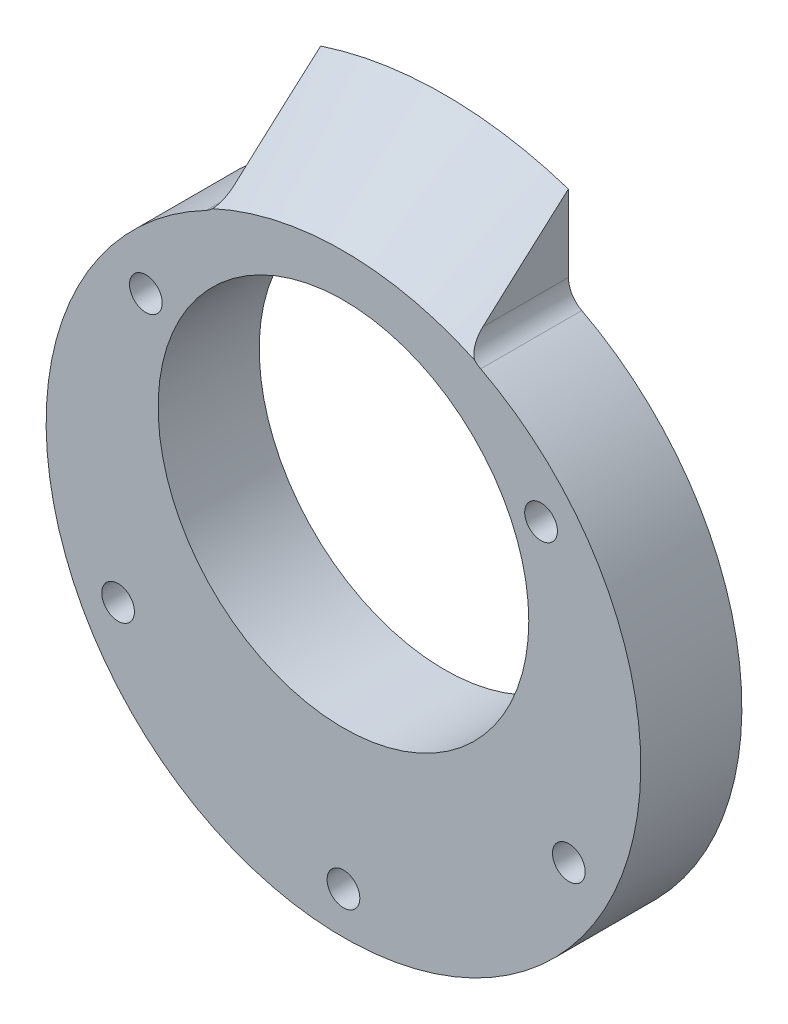
ISO-10303-21;
HEADER;
FILE_DESCRIPTION(('STEP AP214'),'2;1');
FILE_NAME('part.step','',(''),(''),'','','');
FILE_SCHEMA(('AUTOMOTIVE_DESIGN { 1 0 10303 214 1 1 1 1 }'));
ENDSEC;
DATA;
#1=APPLICATION_CONTEXT('core data for automotive mechanical design processes');
#2=APPLICATION_PROTOCOL_DEFINITION('international standard','automotive_design',2000,#1);
#3=PRODUCT_CONTEXT('',#1,'mechanical');
#4=PRODUCT('Part','Part','',(#3));
#5=PRODUCT_RELATED_PRODUCT_CATEGORY('part','',(#4));
#6=PRODUCT_DEFINITION_FORMATION('','',#4);
#7=PRODUCT_DEFINITION_CONTEXT('part definition',#1,'design');
#8=PRODUCT_DEFINITION('design','',#6,#7);
#9=PRODUCT_DEFINITION_SHAPE('','',#8);
#10=(LENGTH_UNIT() NAMED_UNIT(*) SI_UNIT(.MILLI.,.METRE.));
#11=(NAMED_UNIT(*) PLANE_ANGLE_UNIT() SI_UNIT($,.RADIAN.));
#12=(NAMED_UNIT(*) SI_UNIT($,.STERADIAN.) SOLID_ANGLE_UNIT());
#13=UNCERTAINTY_MEASURE_WITH_UNIT(LENGTH_MEASURE(1.E-05),#10,'distance_accuracy_value','');
#14=(GEOMETRIC_REPRESENTATION_CONTEXT(3) GLOBAL_UNCERTAINTY_ASSIGNED_CONTEXT((#13)) GLOBAL_UNIT_ASSIGNED_CONTEXT((#10,
#11,#12)) REPRESENTATION_CONTEXT('',''));
#15=CARTESIAN_POINT('',(0.,0.,0.));
#16=DIRECTION('',(0.,0.,1.));
#17=DIRECTION('',(1.,0.,0.));
#18=AXIS2_PLACEMENT_3D('',#15,#16,#17);
#19=CARTESIAN_POINT('',(22.7400198301594,-12.081142252451,17.201));
#20=DIRECTION('',(0.,0.,-1.));
#21=DIRECTION('',(-1.,0.,0.));
#22=AXIS2_PLACEMENT_3D('',#19,#20,#21);
#23=CYLINDRICAL_SURFACE('',#22,1.65);
#24=CARTESIAN_POINT('',(22.7400198301594,-12.081142252451,17.2));
#25=DIRECTION('',(0.,0.,1.));
#26=DIRECTION('',(1.,0.,0.));
#27=AXIS2_PLACEMENT_3D('',#24,#25,#26);
#28=CIRCLE('',#27,1.65);
#29=CARTESIAN_POINT('',(24.3900198301594,-12.081142252451,17.2));
#30=VERTEX_POINT('',#29);
#31=EDGE_CURVE('E281',#30,#30,#28,.T.);
#32=ORIENTED_EDGE('',*,*,#31,.T.);
#33=EDGE_LOOP('',(#32));
#34=FACE_BOUND('',#33,.T.);
#35=CARTESIAN_POINT('',(22.7400198301594,-12.081142252451,14.2));
#36=DIRECTION('',(0.,0.,1.));
#37=DIRECTION('',(1.,0.,0.));
#38=AXIS2_PLACEMENT_3D('',#35,#36,#37);
#39=CIRCLE('',#38,1.65);
#40=CARTESIAN_POINT('',(24.3900198301594,-12.081142252451,14.2));
#41=VERTEX_POINT('',#40);
#42=EDGE_CURVE('E285',#41,#41,#39,.T.);
#43=ORIENTED_EDGE('',*,*,#42,.F.);
#44=EDGE_LOOP('',(#43));
#45=FACE_BOUND('',#44,.T.);
#46=ADVANCED_FACE('F50',(#34,#45),#23,.F.);
#47=CARTESIAN_POINT('',(19.9368843370751,16.2967218461287,17.201));
#48=DIRECTION('',(0.,0.,-1.));
#49=DIRECTION('',(-1.,0.,0.));
#50=AXIS2_PLACEMENT_3D('',#47,#48,#49);
#51=CYLINDRICAL_SURFACE('',#50,1.65);
#52=CARTESIAN_POINT('',(19.9368843370751,16.2967218461287,17.2));
#53=DIRECTION('',(0.,0.,1.));
#54=DIRECTION('',(1.,0.,0.));
#55=AXIS2_PLACEMENT_3D('',#52,#53,#54);
#56=CIRCLE('',#55,1.65);
#57=CARTESIAN_POINT('',(21.5868843370751,16.2967218461287,17.2));
#58=VERTEX_POINT('',#57);
#59=EDGE_CURVE('E289',#58,#58,#56,.T.);
#60=ORIENTED_EDGE('',*,*,#59,.T.);
#61=EDGE_LOOP('',(#60));
#62=FACE_BOUND('',#61,.T.);
#63=CARTESIAN_POINT('',(19.9368843370751,16.2967218461287,14.2));
#64=DIRECTION('',(0.,0.,1.));
#65=DIRECTION('',(1.,0.,0.));
#66=AXIS2_PLACEMENT_3D('',#63,#64,#65);
#67=CIRCLE('',#66,1.65);
#68=CARTESIAN_POINT('',(21.5868843370751,16.2967218461287,14.2));
#69=VERTEX_POINT('',#68);
#70=EDGE_CURVE('E309',#69,#69,#67,.T.);
#71=ORIENTED_EDGE('',*,*,#70,.F.);
#72=EDGE_LOOP('',(#71));
#73=FACE_BOUND('',#72,.T.);
#74=ADVANCED_FACE('F377',(#62,#73),#51,.F.);
#75=CARTESIAN_POINT('',(-19.9368843370751,16.2967218461287,17.201));
#76=DIRECTION('',(0.,0.,-1.));
#77=DIRECTION('',(-1.,0.,0.));
#78=AXIS2_PLACEMENT_3D('',#75,#76,#77);
#79=CYLINDRICAL_SURFACE('',#78,1.65);
#80=CARTESIAN_POINT('',(-19.9368843370751,16.2967218461287,17.2));
#81=DIRECTION('',(0.,0.,1.));
#82=DIRECTION('',(1.,0.,0.));
#83=AXIS2_PLACEMENT_3D('',#80,#81,#82);
#84=CIRCLE('',#83,1.65);
#85=CARTESIAN_POINT('',(-18.2868843370751,16.2967218461287,17.2));
#86=VERTEX_POINT('',#85);
#87=EDGE_CURVE('E306',#86,#86,#84,.T.);
#88=ORIENTED_EDGE('',*,*,#87,.T.);
#89=EDGE_LOOP('',(#88));
#90=FACE_BOUND('',#89,.T.);
#91=CARTESIAN_POINT('',(-19.9368843370751,16.2967218461287,14.2));
#92=DIRECTION('',(0.,0.,1.));
#93=DIRECTION('',(1.,0.,0.));
#94=AXIS2_PLACEMENT_3D('',#91,#92,#93);
#95=CIRCLE('',#94,1.65);
#96=CARTESIAN_POINT('',(-18.2868843370751,16.2967218461287,14.2));
#97=VERTEX_POINT('',#96);
#98=EDGE_CURVE('E303',#97,#97,#95,.T.);
#99=ORIENTED_EDGE('',*,*,#98,.F.);
#100=EDGE_LOOP('',(#99));
#101=FACE_BOUND('',#100,.T.);
#102=ADVANCED_FACE('F382',(#90,#101),#79,.F.);
#103=CARTESIAN_POINT('',(-22.7400198301594,-12.081142252451,17.201));
#104=DIRECTION('',(0.,0.,-1.));
#105=DIRECTION('',(-1.,0.,0.));
#106=AXIS2_PLACEMENT_3D('',#103,#104,#105);
#107=CYLINDRICAL_SURFACE('',#106,1.65);
#108=CARTESIAN_POINT('',(-22.7400198301594,-12.081142252451,17.2));
#109=DIRECTION('',(0.,0.,1.));
#110=DIRECTION('',(1.,0.,0.));
#111=AXIS2_PLACEMENT_3D('',#108,#109,#110);
#112=CIRCLE('',#111,1.65);
#113=CARTESIAN_POINT('',(-21.0900198301594,-12.081142252451,17.2));
#114=VERTEX_POINT('',#113);
#115=EDGE_CURVE('E300',#114,#114,#112,.T.);
#116=ORIENTED_EDGE('',*,*,#115,.T.);
#117=EDGE_LOOP('',(#116));
#118=FACE_BOUND('',#117,.T.);
#119=CARTESIAN_POINT('',(-22.7400198301594,-12.081142252451,14.2));
#120=DIRECTION('',(0.,0.,1.));
#121=DIRECTION('',(1.,0.,0.));
#122=AXIS2_PLACEMENT_3D('',#119,#120,#121);
#123=CIRCLE('',#122,1.65);
#124=CARTESIAN_POINT('',(-21.0900198301594,-12.081142252451,14.2));
#125=VERTEX_POINT('',#124);
#126=EDGE_CURVE('E295',#125,#125,#123,.T.);
#127=ORIENTED_EDGE('',*,*,#126,.F.);
#128=EDGE_LOOP('',(#127));
#129=FACE_BOUND('',#128,.T.);
#130=ADVANCED_FACE('F415',(#118,#129),#107,.F.);
#131=CARTESIAN_POINT('',(0.,-25.75,17.201));
#132=DIRECTION('',(0.,0.,-1.));
#133=DIRECTION('',(-1.,0.,0.));
#134=AXIS2_PLACEMENT_3D('',#131,#132,#133);
#135=CYLINDRICAL_SURFACE('',#134,1.65);
#136=CARTESIAN_POINT('',(0.,-25.75,17.2));
#137=DIRECTION('',(0.,0.,1.));
#138=DIRECTION('',(1.,0.,0.));
#139=AXIS2_PLACEMENT_3D('',#136,#137,#138);
#140=CIRCLE('',#139,1.65);
#141=CARTESIAN_POINT('',(1.65,-25.75,17.2));
#142=VERTEX_POINT('',#141);
#143=EDGE_CURVE('E292',#142,#142,#140,.T.);
#144=ORIENTED_EDGE('',*,*,#143,.T.);
#145=EDGE_LOOP('',(#144));
#146=FACE_BOUND('',#145,.T.);
#147=CARTESIAN_POINT('',(0.,-25.75,14.2));
#148=DIRECTION('',(0.,0.,1.));
#149=DIRECTION('',(1.,0.,0.));
#150=AXIS2_PLACEMENT_3D('',#147,#148,#149);
#151=CIRCLE('',#150,1.65);
#152=CARTESIAN_POINT('',(1.65,-25.75,14.2));
#153=VERTEX_POINT('',#152);
#154=EDGE_CURVE('E296',#153,#153,#151,.T.);
#155=ORIENTED_EDGE('',*,*,#154,.F.);
#156=EDGE_LOOP('',(#155));
#157=FACE_BOUND('',#156,.T.);
#158=ADVANCED_FACE('F388',(#146,#157),#135,.F.);
#159=CARTESIAN_POINT('',(0.,0.,17.2));
#160=DIRECTION('',(0.,0.,1.));
#161=DIRECTION('',(1.,0.,0.));
#162=AXIS2_PLACEMENT_3D('',#159,#160,#161);
#163=PLANE('',#162);
#164=ORIENTED_EDGE('',*,*,#143,.F.);
#165=EDGE_LOOP('',(#164));
#166=FACE_BOUND('',#165,.T.);
#167=ORIENTED_EDGE('',*,*,#115,.F.);
#168=EDGE_LOOP('',(#167));
#169=FACE_BOUND('',#168,.T.);
#170=ORIENTED_EDGE('',*,*,#87,.F.);
#171=EDGE_LOOP('',(#170));
#172=FACE_BOUND('',#171,.T.);
#173=ORIENTED_EDGE('',*,*,#59,.F.);
#174=EDGE_LOOP('',(#173));
#175=FACE_BOUND('',#174,.T.);
#176=ORIENTED_EDGE('',*,*,#31,.F.);
#177=EDGE_LOOP('',(#176));
#178=FACE_BOUND('',#177,.T.);
#179=CARTESIAN_POINT('',(0.,7.,17.2));
#180=DIRECTION('',(0.,0.,1.));
#181=DIRECTION('',(1.,0.,0.));
#182=AXIS2_PLACEMENT_3D('',#179,#180,#181);
#183=CIRCLE('',#182,18.7);
#184=CARTESIAN_POINT('',(18.7,7.,17.2));
#185=VERTEX_POINT('',#184);
#186=EDGE_CURVE('E128',#185,#185,#183,.T.);
#187=ORIENTED_EDGE('',*,*,#186,.F.);
#188=EDGE_LOOP('',(#187));
#189=FACE_BOUND('',#188,.T.);
#190=CARTESIAN_POINT('',(0.,-1.36410985670536,17.2));
#191=DIRECTION('',(0.,0.,-1.));
#192=DIRECTION('',(0.,1.,0.));
#193=AXIS2_PLACEMENT_3D('',#190,#191,#192);
#194=CIRCLE('',#193,31.3641098567054);
#195=CARTESIAN_POINT('',(-13.2167610524739,27.0792481445098,17.2));
#196=VERTEX_POINT('',#195);
#197=CARTESIAN_POINT('',(13.2167610524739,27.0792481445098,17.2));
#198=VERTEX_POINT('',#197);
#199=EDGE_CURVE('E114',#196,#198,#194,.T.);
#200=ORIENTED_EDGE('',*,*,#199,.F.);
#201=CARTESIAN_POINT('',(-15.,28.831406486677,17.2));
#202=DIRECTION('',(0.,0.,1.));
#203=DIRECTION('',(1.,0.,0.));
#204=AXIS2_PLACEMENT_3D('',#201,#202,#203);
#205=CIRCLE('',#204,2.5);
#206=CARTESIAN_POINT('',(-13.8461538461538,26.6136059877019,17.2));
#207=VERTEX_POINT('',#206);
#208=EDGE_CURVE('E108',#196,#207,#205,.F.);
#209=ORIENTED_EDGE('',*,*,#208,.T.);
#210=CARTESIAN_POINT('',(0.,0.,17.2));
#211=DIRECTION('',(0.,0.,1.));
#212=DIRECTION('',(1.,0.,0.));
#213=AXIS2_PLACEMENT_3D('',#210,#211,#212);
#214=CIRCLE('',#213,30.);
#215=CARTESIAN_POINT('',(13.8461538461539,26.6136059877018,17.2));
#216=VERTEX_POINT('',#215);
#217=EDGE_CURVE('E112',#207,#216,#214,.T.);
#218=ORIENTED_EDGE('',*,*,#217,.T.);
#219=CARTESIAN_POINT('',(15.,28.831406486677,17.2));
#220=DIRECTION('',(0.,0.,1.));
#221=DIRECTION('',(1.,0.,0.));
#222=AXIS2_PLACEMENT_3D('',#219,#220,#221);
#223=CIRCLE('',#222,2.5);
#224=EDGE_CURVE('E119',#216,#198,#223,.F.);
#225=ORIENTED_EDGE('',*,*,#224,.T.);
#226=EDGE_LOOP('',(#200,#209,#218,#225));
#227=FACE_BOUND('',#226,.T.);
#228=ADVANCED_FACE('F110',(#166,#169,#172,#175,#178,#189,#227),#163,.T.);
#229=CARTESIAN_POINT('',(0.,-1.36410985670536,17.2));
#230=DIRECTION('',(0.,0.,-1.));
#231=DIRECTION('',(0.,1.,0.));
#232=AXIS2_PLACEMENT_3D('',#229,#230,#231);
#233=CONICAL_SURFACE('',#232,31.3641098567054,0.698131700797737);
#234=CARTESIAN_POINT('',(-12.5,50.8468703549093,-9.40274616536203));
#235=CARTESIAN_POINT('',(-12.5,50.0851531984235,-8.51992606426166));
#236=CARTESIAN_POINT('',(-12.5,49.322927588947,-7.63754425473601));
#237=CARTESIAN_POINT('',(-12.5,47.7972935715927,-5.87380267880364));
#238=CARTESIAN_POINT('',(-12.5,47.03388516284,-4.99244291315382));
#239=CARTESIAN_POINT('',(-12.5,45.5057673685733,-3.23094589411075));
#240=CARTESIAN_POINT('',(-12.5,44.7410580652193,-2.35080856945586));
#241=CARTESIAN_POINT('',(-12.5,43.2100844868148,-0.591887141430708));
#242=CARTESIAN_POINT('',(-12.5,42.4438202117553,0.286896961931756));
#243=CARTESIAN_POINT('',(-12.5,40.9098969536509,2.04241941414718));
#244=CARTESIAN_POINT('',(-12.5,40.1422389347919,2.91915860529604));
#245=CARTESIAN_POINT('',(-12.5,38.6048140782924,4.67078592194522));
#246=CARTESIAN_POINT('',(-12.5,37.8350472414888,5.54567404817985));
#247=CARTESIAN_POINT('',(-12.5,36.2929699134393,7.29331731884966));
#248=CARTESIAN_POINT('',(-12.5,35.5206592448358,8.16607230684059));
#249=CARTESIAN_POINT('',(-12.5,33.973073453469,9.90894898921815));
#250=CARTESIAN_POINT('',(-12.5,33.1977983346898,10.779070687141));
#251=CARTESIAN_POINT('',(-12.5,31.6430593081197,12.5168108221686));
#252=CARTESIAN_POINT('',(-12.5,30.8635925612526,13.3844267205802));
#253=CARTESIAN_POINT('',(-12.5,29.3003035200454,15.1157167599663));
#254=CARTESIAN_POINT('',(-12.5,28.5164812575262,15.9793909296549));
#255=CARTESIAN_POINT('',(-12.5,26.9435785416374,17.7016760322996));
#256=CARTESIAN_POINT('',(-12.5,26.1544989971833,18.560287794456));
#257=CARTESIAN_POINT('',(-12.5,24.5695479192523,20.2712702844259));
#258=CARTESIAN_POINT('',(-12.5,23.7736761945709,21.1236408352815));
#259=CARTESIAN_POINT('',(-12.5,22.172716729157,22.8208424401292));
#260=CARTESIAN_POINT('',(-12.5,21.3676228827496,23.6656677508583));
#261=CARTESIAN_POINT('',(-12.5,20.1515015408924,24.92465711199));
#262=CARTESIAN_POINT('',(-12.5,19.7447283149174,25.342931374776));
#263=CARTESIAN_POINT('',(-12.5,18.9278940711632,26.1762553072781));
#264=CARTESIAN_POINT('',(-12.5,18.5178330737323,26.5913049969201));
#265=CARTESIAN_POINT('',(-12.5,17.6936538058491,27.4178428757852));
#266=CARTESIAN_POINT('',(-12.5,17.2795333098375,27.8293288480976));
#267=CARTESIAN_POINT('',(-12.5,16.446829407107,28.6477454029992));
#268=CARTESIAN_POINT('',(-12.5,16.0282461025848,29.0546760894673));
#269=CARTESIAN_POINT('',(-12.5,15.1856946819052,29.8631615858419));
#270=CARTESIAN_POINT('',(-12.5,14.7617251742219,30.2647149491199));
#271=CARTESIAN_POINT('',(-12.5,14.1210533535251,30.8620163382053));
#272=CARTESIAN_POINT('',(-12.5,13.9067010779417,31.0602865887209));
#273=CARTESIAN_POINT('',(-12.5,13.4762714391526,31.4549520359493));
#274=CARTESIAN_POINT('',(-12.5,13.2601940484675,31.6513472026838));
#275=CARTESIAN_POINT('',(-12.5,13.0431784883644,31.8467050538356));
#276=B_SPLINE_CURVE_WITH_KNOTS('',3,(#234,#235,#236,#237,#238,#239,#240,#241,#242,#243,#244,
#245,#246,#247,#248,#249,#250,#251,#252,#253,#254,#255,#256,#257,#258,#259,#260,#261,#262,#263,
#264,#265,#266,#267,#268,#269,#270,#271,#272,#273,#274,#275),.UNSPECIFIED.,.F.,.F.,(4,2,2,2,2,2,
2,2,2,2,2,2,2,2,2,2,2,2,2,2,4),(0.,3.49803675220805,6.99607609336248,10.4939021547425,
13.9917282362974,17.4876850453952,20.9836404673857,24.4798450193494,27.9760448741326,
31.4750230042518,34.9739756047865,38.4723382163276,41.9707996362083,45.4717291795481,
47.2220748558584,48.9724097074802,50.7237647815261,52.4750798359166,54.2268569353613,
55.1028161604587,55.9787893666951),.UNSPECIFIED.);
#277=CARTESIAN_POINT('',(-12.5,36.5514545985942,7.));
#278=VERTEX_POINT('',#277);
#279=CARTESIAN_POINT('',(-12.5,28.8314064866707,15.6311120684087));
#280=VERTEX_POINT('',#279);
#281=EDGE_CURVE('E180',#278,#280,#276,.T.);
#282=ORIENTED_EDGE('',*,*,#281,.T.);
#283=CARTESIAN_POINT('',(-12.5,28.831406486677,15.6311120684148));
#284=CARTESIAN_POINT('',(-12.5000180547228,28.7613057333256,15.7082905301787));
#285=CARTESIAN_POINT('',(-12.502950073445,28.6905055000807,15.7848783592498));
#286=CARTESIAN_POINT('',(-12.5151245172802,28.5475494943628,15.9365269958833));
#287=CARTESIAN_POINT('',(-12.5243785880777,28.4753914596739,16.0115847216593));
#288=CARTESIAN_POINT('',(-12.5499354728405,28.3285734508648,16.1610145606442));
#289=CARTESIAN_POINT('',(-12.5663752287439,28.253892282281,16.2353431212568));
#290=CARTESIAN_POINT('',(-12.6069695790642,28.1037771485222,16.3809660259658));
#291=CARTESIAN_POINT('',(-12.6311181946983,28.0283438104876,16.4522626731307));
#292=CARTESIAN_POINT('',(-12.6995504802416,27.8460462449286,16.6193858109902));
#293=CARTESIAN_POINT('',(-12.748029878169,27.7389530464449,16.713309841027));
#294=CARTESIAN_POINT('',(-12.8641796501432,27.5265079321877,16.8889858457988));
#295=CARTESIAN_POINT('',(-12.9316792533964,27.4211489739969,16.970836681882));
#296=CARTESIAN_POINT('',(-13.0409712862899,27.277440743452,17.0730012693413));
#297=CARTESIAN_POINT('',(-13.0735675057658,27.2371605737853,17.1005570000256));
#298=CARTESIAN_POINT('',(-13.1424097461132,27.1574461809844,17.1526776721456));
#299=CARTESIAN_POINT('',(-13.1786703714244,27.1180161689444,17.1772297089786));
#300=CARTESIAN_POINT('',(-13.2167610524739,27.0792481445098,17.2));
#301=B_SPLINE_CURVE_WITH_KNOTS('',3,(#283,#284,#285,#286,#287,#288,#289,#290,#291,#292,#293,
#294,#295,#296,#297,#298,#299,#300),.UNSPECIFIED.,.F.,.F.,(4,2,2,2,2,2,2,2,4),(0.,
0.31279086502373,0.626159472962992,0.945779909206193,1.26515305630839,1.71523098630133,
2.16139009557992,2.33728438999816,2.51390964269015),.UNSPECIFIED.);
#302=EDGE_CURVE('E120',#280,#196,#301,.T.);
#303=ORIENTED_EDGE('',*,*,#302,.T.);
#304=ORIENTED_EDGE('',*,*,#199,.T.);
#305=CARTESIAN_POINT('',(13.2167610524739,27.0792481445098,17.2));
#306=CARTESIAN_POINT('',(13.1674533873038,27.1294377307713,17.1705180387058));
#307=CARTESIAN_POINT('',(13.1212306953103,27.1807081032569,17.1380733621241));
#308=CARTESIAN_POINT('',(13.034777287571,27.2846487881091,17.0682730048438));
#309=CARTESIAN_POINT('',(12.9945303123492,27.337314824445,17.0309311910953));
#310=CARTESIAN_POINT('',(12.8829492104949,27.4955016855323,16.9136871459972));
#311=CARTESIAN_POINT('',(12.8196826390364,27.6023663820423,16.8278618092117));
#312=CARTESIAN_POINT('',(12.7285534239372,27.7838004928499,16.6735440805631));
#313=CARTESIAN_POINT('',(12.6957741366582,27.8583190905799,16.6077061877051));
#314=CARTESIAN_POINT('',(12.6384913833664,28.0070173854059,16.4721399051234));
#315=CARTESIAN_POINT('',(12.6139901579901,28.0811969853936,16.4024104680104));
#316=CARTESIAN_POINT('',(12.5515592557461,28.3032909958381,16.1881564057222));
#317=CARTESIAN_POINT('',(12.5249933452727,28.4501486876684,16.0390966404128));
#318=CARTESIAN_POINT('',(12.5074560458104,28.634352667458,15.844577519957));
#319=CARTESIAN_POINT('',(12.5046349931076,28.6741674207291,15.8020692590805));
#320=CARTESIAN_POINT('',(12.5009121126138,28.7531878675719,15.7168134442988));
#321=CARTESIAN_POINT('',(12.5000004735956,28.792395642029,15.6740682509089));
#322=CARTESIAN_POINT('',(12.4999999999997,28.8314064866771,15.6311120684019));
#323=B_SPLINE_CURVE_WITH_KNOTS('',3,(#305,#306,#307,#308,#309,#310,#311,#312,#313,#314,#315,
#316,#317,#318,#319,#320,#321,#322),.UNSPECIFIED.,.F.,.F.,(4,2,2,2,2,2,2,2,4),(0.,
0.228512585489254,0.456391539177773,0.907017426779386,1.22075551519677,1.53457845570805,
2.16477708201638,2.33970082906864,2.51372353000393),.UNSPECIFIED.);
#324=CARTESIAN_POINT('',(12.5,28.831406486677,15.6311120684018));
#325=VERTEX_POINT('',#324);
#326=EDGE_CURVE('E142',#198,#325,#323,.T.);
#327=ORIENTED_EDGE('',*,*,#326,.T.);
#328=CARTESIAN_POINT('',(12.5,13.0431784883644,31.8467050538355));
#329=CARTESIAN_POINT('',(12.5,13.4039717276052,31.521873237884));
#330=CARTESIAN_POINT('',(12.5,13.7622033765008,31.194219862921));
#331=CARTESIAN_POINT('',(12.5,14.4741567961101,30.5340837434552));
#332=CARTESIAN_POINT('',(12.5,14.827878805157,30.2016012561731));
#333=CARTESIAN_POINT('',(12.5,15.5313947519833,29.5326522473565));
#334=CARTESIAN_POINT('',(12.5,15.8811894536693,29.1961865277127));
#335=CARTESIAN_POINT('',(12.5,16.5774198893036,28.519790497555));
#336=CARTESIAN_POINT('',(12.5,16.9238555718795,28.1798601342159));
#337=CARTESIAN_POINT('',(12.5,17.9584496009228,27.1559587393375));
#338=CARTESIAN_POINT('',(12.5,18.6422270384982,26.4675597984075));
#339=CARTESIAN_POINT('',(12.5,20.0007552801485,25.0818622608053));
#340=CARTESIAN_POINT('',(12.5,20.6755055465767,24.3845631388402));
#341=CARTESIAN_POINT('',(12.5,22.0173703060671,22.9835773957626));
#342=CARTESIAN_POINT('',(12.5,22.6844897013729,22.279895464534));
#343=CARTESIAN_POINT('',(12.5,24.0129517963647,20.8671337114615));
#344=CARTESIAN_POINT('',(12.5,24.6742946128153,20.1580539992702));
#345=CARTESIAN_POINT('',(12.5,25.9923460095922,18.7354691280881));
#346=CARTESIAN_POINT('',(12.5,26.6490541076951,18.0219635227002));
#347=CARTESIAN_POINT('',(12.5,27.9585879857312,16.5913969296223));
#348=CARTESIAN_POINT('',(12.5,28.6114137553399,15.8743359324866));
#349=CARTESIAN_POINT('',(12.5,29.5267652756276,14.8643427669234));
#350=CARTESIAN_POINT('',(12.5,29.790648197186,14.5726391191917));
#351=CARTESIAN_POINT('',(12.5,30.317909490114,13.9887860278906));
#352=CARTESIAN_POINT('',(12.5,30.581287870843,13.6966365927748));
#353=CARTESIAN_POINT('',(12.5,31.3707607153536,12.8195188905955));
#354=CARTESIAN_POINT('',(12.5,31.896156348295,12.2339215564522));
#355=CARTESIAN_POINT('',(12.5,33.1980980298977,10.7787377147617));
#356=CARTESIAN_POINT('',(12.5,33.973670095103,9.9082799008327));
#357=CARTESIAN_POINT('',(12.5,35.5218486448539,8.16472997014112));
#358=CARTESIAN_POINT('',(12.5,36.2944551246732,7.29163784918418));
#359=CARTESIAN_POINT('',(12.5,37.8371828571658,5.54325001152055));
#360=CARTESIAN_POINT('',(12.5,38.60730409169,4.66795427880415));
#361=CARTESIAN_POINT('',(12.5,40.145436278585,2.91551047978974));
#362=CARTESIAN_POINT('',(12.5,40.9134472300882,2.0383624127304));
#363=CARTESIAN_POINT('',(12.5,42.4474267560939,0.282763199501142));
#364=CARTESIAN_POINT('',(12.5,43.2133958911408,-0.595687456988416));
#365=CARTESIAN_POINT('',(12.5,44.7437809591626,-2.35394101730411));
#366=CARTESIAN_POINT('',(12.5,45.5081968915695,-3.2337439216246));
#367=CARTESIAN_POINT('',(12.5,47.0356646718565,-4.99449674347946));
#368=CARTESIAN_POINT('',(12.5,47.7987165512562,-5.87544663367535));
#369=CARTESIAN_POINT('',(12.5,49.323638400513,-7.63836710813876));
#370=CARTESIAN_POINT('',(12.5,50.0855083716882,-8.52033769126604));
#371=CARTESIAN_POINT('',(12.5,50.8468703549093,-9.40274616536203));
#372=B_SPLINE_CURVE_WITH_KNOTS('',3,(#328,#329,#330,#331,#332,#333,#334,#335,#336,#337,#338,
#339,#340,#341,#342,#343,#344,#345,#346,#347,#348,#349,#350,#351,#352,#353,#354,#355,#356,#357,
#358,#359,#360,#361,#362,#363,#364,#365,#366,#367,#368,#369,#370,#371),.UNSPECIFIED.,.F.,.F.,(4,
2,2,2,2,2,2,2,2,2,2,2,2,2,2,2,2,2,2,2,2,4),(0.,1.45639172177276,2.91270615188872,
4.36873222565312,5.82478053263438,8.73549875631917,11.646389573683,14.5552914835,
17.4641344576793,20.3732757504677,23.282424776361,24.462478185536,25.6425094881752,
28.0027353422728,31.5002800189308,34.9978302673026,38.4954059998768,41.9929831702752,
45.4894733810931,48.9859648704474,52.482374492964,55.9787802133411),.UNSPECIFIED.);
#373=CARTESIAN_POINT('',(12.5,36.5514545985942,7.));
#374=VERTEX_POINT('',#373);
#375=EDGE_CURVE('E174',#325,#374,#372,.T.);
#376=ORIENTED_EDGE('',*,*,#375,.T.);
#377=CARTESIAN_POINT('',(0.,-1.36410985670536,6.99999999999999));
#378=DIRECTION('',(0.,0.,-1.));
#379=DIRECTION('',(0.,1.,0.));
#380=AXIS2_PLACEMENT_3D('',#377,#378,#379);
#381=CIRCLE('',#380,39.9229260947137);
#382=EDGE_CURVE('E163',#278,#374,#381,.T.);
#383=ORIENTED_EDGE('',*,*,#382,.F.);
#384=EDGE_LOOP('',(#282,#303,#304,#327,#376,#383));
#385=FACE_BOUND('',#384,.T.);
#386=ADVANCED_FACE('F190',(#385),#233,.T.);
#387=CARTESIAN_POINT('',(12.5,0.,7.));
#388=DIRECTION('',(1.,0.,0.));
#389=DIRECTION('',(0.,1.,0.));
#390=AXIS2_PLACEMENT_3D('',#387,#388,#389);
#391=PLANE('',#390);
#392=DIRECTION('',(0.,-1.,0.));
#393=VECTOR('',#392,1.);
#394=CARTESIAN_POINT('',(12.5,0.,7.));
#395=LINE('',#394,#393);
#396=CARTESIAN_POINT('',(12.5,28.831406486677,7.));
#397=VERTEX_POINT('',#396);
#398=EDGE_CURVE('E68',#374,#397,#395,.T.);
#399=ORIENTED_EDGE('',*,*,#398,.F.);
#400=ORIENTED_EDGE('',*,*,#375,.F.);
#401=DIRECTION('',(0.,0.,-1.));
#402=VECTOR('',#401,1.);
#403=CARTESIAN_POINT('',(12.5,28.831406486677,7.));
#404=LINE('',#403,#402);
#405=EDGE_CURVE('E136',#325,#397,#404,.T.);
#406=ORIENTED_EDGE('',*,*,#405,.T.);
#407=EDGE_LOOP('',(#399,#400,#406));
#408=FACE_BOUND('',#407,.T.);
#409=ADVANCED_FACE('F186',(#408),#391,.T.);
#410=CARTESIAN_POINT('',(0.,0.,7.));
#411=DIRECTION('',(0.,0.,-1.));
#412=DIRECTION('',(-1.,0.,0.));
#413=AXIS2_PLACEMENT_3D('',#410,#411,#412);
#414=CYLINDRICAL_SURFACE('',#413,30.);
#415=DIRECTION('',(0.,0.,-1.));
#416=VECTOR('',#415,1.);
#417=CARTESIAN_POINT('',(-13.8461538461538,26.6136059877018,7.));
#418=LINE('',#417,#416);
#419=CARTESIAN_POINT('',(-13.8461538461538,26.6136059877018,7.));
#420=VERTEX_POINT('',#419);
#421=EDGE_CURVE('E125',#207,#420,#418,.T.);
#422=ORIENTED_EDGE('',*,*,#421,.T.);
#423=CARTESIAN_POINT('',(0.,0.,7.));
#424=DIRECTION('',(0.,0.,1.));
#425=DIRECTION('',(1.,0.,0.));
#426=AXIS2_PLACEMENT_3D('',#423,#424,#425);
#427=CIRCLE('',#426,30.);
#428=CARTESIAN_POINT('',(13.8461538461539,26.6136059877018,7.));
#429=VERTEX_POINT('',#428);
#430=EDGE_CURVE('E160',#420,#429,#427,.T.);
#431=ORIENTED_EDGE('',*,*,#430,.T.);
#432=DIRECTION('',(0.,0.,-1.));
#433=VECTOR('',#432,1.);
#434=CARTESIAN_POINT('',(13.8461538461539,26.6136059877018,7.));
#435=LINE('',#434,#433);
#436=EDGE_CURVE('E127',#429,#216,#435,.F.);
#437=ORIENTED_EDGE('',*,*,#436,.T.);
#438=ORIENTED_EDGE('',*,*,#217,.F.);
#439=EDGE_LOOP('',(#422,#431,#437,#438));
#440=FACE_BOUND('',#439,.T.);
#441=ADVANCED_FACE('F124',(#440),#414,.T.);
#442=CARTESIAN_POINT('',(15.,28.831406486677,7.));
#443=DIRECTION('',(0.,0.,-1.));
#444=DIRECTION('',(-1.,0.,0.));
#445=AXIS2_PLACEMENT_3D('',#442,#443,#444);
#446=CYLINDRICAL_SURFACE('',#445,2.5);
#447=ORIENTED_EDGE('',*,*,#436,.F.);
#448=CARTESIAN_POINT('',(15.,28.831406486677,7.));
#449=DIRECTION('',(0.,0.,1.));
#450=DIRECTION('',(1.,0.,0.));
#451=AXIS2_PLACEMENT_3D('',#448,#449,#450);
#452=CIRCLE('',#451,2.5);
#453=EDGE_CURVE('E159',#429,#397,#452,.F.);
#454=ORIENTED_EDGE('',*,*,#453,.T.);
#455=ORIENTED_EDGE('',*,*,#405,.F.);
#456=ORIENTED_EDGE('',*,*,#326,.F.);
#457=ORIENTED_EDGE('',*,*,#224,.F.);
#458=EDGE_LOOP('',(#447,#454,#455,#456,#457));
#459=FACE_BOUND('',#458,.T.);
#460=ADVANCED_FACE('F52',(#459),#446,.F.);
#461=CARTESIAN_POINT('',(-12.5,0.,7.));
#462=DIRECTION('',(-1.,0.,0.));
#463=DIRECTION('',(0.,-1.,0.));
#464=AXIS2_PLACEMENT_3D('',#461,#462,#463);
#465=PLANE('',#464);
#466=DIRECTION('',(0.,1.,0.));
#467=VECTOR('',#466,1.);
#468=CARTESIAN_POINT('',(-12.5,0.,7.));
#469=LINE('',#468,#467);
#470=CARTESIAN_POINT('',(-12.5,28.831406486677,7.));
#471=VERTEX_POINT('',#470);
#472=EDGE_CURVE('E75',#471,#278,#469,.T.);
#473=ORIENTED_EDGE('',*,*,#472,.F.);
#474=DIRECTION('',(0.,0.,-1.));
#475=VECTOR('',#474,1.);
#476=CARTESIAN_POINT('',(-12.5,28.831406486677,7.));
#477=LINE('',#476,#475);
#478=EDGE_CURVE('E134',#471,#280,#477,.F.);
#479=ORIENTED_EDGE('',*,*,#478,.T.);
#480=ORIENTED_EDGE('',*,*,#281,.F.);
#481=EDGE_LOOP('',(#473,#479,#480));
#482=FACE_BOUND('',#481,.T.);
#483=ADVANCED_FACE('F207',(#482),#465,.T.);
#484=CARTESIAN_POINT('',(-15.,28.831406486677,7.));
#485=DIRECTION('',(0.,0.,-1.));
#486=DIRECTION('',(-1.,0.,0.));
#487=AXIS2_PLACEMENT_3D('',#484,#485,#486);
#488=CYLINDRICAL_SURFACE('',#487,2.5);
#489=ORIENTED_EDGE('',*,*,#478,.F.);
#490=CARTESIAN_POINT('',(-15.,28.831406486677,7.));
#491=DIRECTION('',(0.,0.,1.));
#492=DIRECTION('',(1.,0.,0.));
#493=AXIS2_PLACEMENT_3D('',#490,#491,#492);
#494=CIRCLE('',#493,2.5);
#495=EDGE_CURVE('E132',#471,#420,#494,.F.);
#496=ORIENTED_EDGE('',*,*,#495,.T.);
#497=ORIENTED_EDGE('',*,*,#421,.F.);
#498=ORIENTED_EDGE('',*,*,#208,.F.);
#499=ORIENTED_EDGE('',*,*,#302,.F.);
#500=EDGE_LOOP('',(#489,#496,#497,#498,#499));
#501=FACE_BOUND('',#500,.T.);
#502=ADVANCED_FACE('F131',(#501),#488,.F.);
#503=CARTESIAN_POINT('',(0.,7.,0.));
#504=DIRECTION('',(0.,0.,1.));
#505=DIRECTION('',(1.,0.,0.));
#506=AXIS2_PLACEMENT_3D('',#503,#504,#505);
#507=CYLINDRICAL_SURFACE('',#506,18.7);
#508=CARTESIAN_POINT('',(0.,7.,7.));
#509=DIRECTION('',(0.,0.,1.));
#510=DIRECTION('',(1.,0.,0.));
#511=AXIS2_PLACEMENT_3D('',#508,#509,#510);
#512=CIRCLE('',#511,18.7);
#513=CARTESIAN_POINT('',(18.7,7.,7.));
#514=VERTEX_POINT('',#513);
#515=EDGE_CURVE('E55',#514,#514,#512,.F.);
#516=ORIENTED_EDGE('',*,*,#515,.T.);
#517=EDGE_LOOP('',(#516));
#518=FACE_BOUND('',#517,.T.);
#519=ORIENTED_EDGE('',*,*,#186,.T.);
#520=EDGE_LOOP('',(#519));
#521=FACE_BOUND('',#520,.T.);
#522=ADVANCED_FACE('F206',(#518,#521),#507,.F.);
#523=CARTESIAN_POINT('',(0.,0.,14.2));
#524=DIRECTION('',(0.,0.,1.));
#525=DIRECTION('',(1.,0.,0.));
#526=AXIS2_PLACEMENT_3D('',#523,#524,#525);
#527=PLANE('',#526);
#528=ORIENTED_EDGE('',*,*,#98,.T.);
#529=EDGE_LOOP('',(#528));
#530=FACE_BOUND('',#529,.T.);
#531=CARTESIAN_POINT('',(-19.9368843370751,16.2967218461287,14.2));
#532=DIRECTION('',(0.,0.,1.));
#533=DIRECTION('',(1.,0.,0.));
#534=AXIS2_PLACEMENT_3D('',#531,#532,#533);
#535=CIRCLE('',#534,3.15);
#536=CARTESIAN_POINT('',(-16.7868843370751,16.2967218461287,14.2));
#537=VERTEX_POINT('',#536);
#538=EDGE_CURVE('E172',#537,#537,#535,.T.);
#539=ORIENTED_EDGE('',*,*,#538,.F.);
#540=EDGE_LOOP('',(#539));
#541=FACE_BOUND('',#540,.T.);
#542=ADVANCED_FACE('F196',(#530,#541),#527,.F.);
#543=CARTESIAN_POINT('',(-19.9368843370751,16.2967218461287,26.1095454429505));
#544=DIRECTION('',(0.,0.,-1.));
#545=DIRECTION('',(-1.,0.,0.));
#546=AXIS2_PLACEMENT_3D('',#543,#544,#545);
#547=CYLINDRICAL_SURFACE('',#546,3.15);
#548=CARTESIAN_POINT('',(-19.9368843370751,16.2967218461287,7.));
#549=DIRECTION('',(0.,0.,1.));
#550=DIRECTION('',(1.,0.,0.));
#551=AXIS2_PLACEMENT_3D('',#548,#549,#550);
#552=CIRCLE('',#551,3.15);
#553=CARTESIAN_POINT('',(-16.7868843370751,16.2967218461287,7.));
#554=VERTEX_POINT('',#553);
#555=EDGE_CURVE('E164',#554,#554,#552,.T.);
#556=ORIENTED_EDGE('',*,*,#555,.F.);
#557=EDGE_LOOP('',(#556));
#558=FACE_BOUND('',#557,.T.);
#559=ORIENTED_EDGE('',*,*,#538,.T.);
#560=EDGE_LOOP('',(#559));
#561=FACE_BOUND('',#560,.T.);
#562=ADVANCED_FACE('F247',(#558,#561),#547,.F.);
#563=CARTESIAN_POINT('',(0.,0.,14.2));
#564=DIRECTION('',(0.,0.,1.));
#565=DIRECTION('',(1.,0.,0.));
#566=AXIS2_PLACEMENT_3D('',#563,#564,#565);
#567=PLANE('',#566);
#568=ORIENTED_EDGE('',*,*,#70,.T.);
#569=EDGE_LOOP('',(#568));
#570=FACE_BOUND('',#569,.T.);
#571=CARTESIAN_POINT('',(19.9368843370751,16.2967218461287,14.2));
#572=DIRECTION('',(0.,0.,1.));
#573=DIRECTION('',(1.,0.,0.));
#574=AXIS2_PLACEMENT_3D('',#571,#572,#573);
#575=CIRCLE('',#574,3.15);
#576=CARTESIAN_POINT('',(23.0868843370751,16.2967218461287,14.2));
#577=VERTEX_POINT('',#576);
#578=EDGE_CURVE('E278',#577,#577,#575,.T.);
#579=ORIENTED_EDGE('',*,*,#578,.F.);
#580=EDGE_LOOP('',(#579));
#581=FACE_BOUND('',#580,.T.);
#582=ADVANCED_FACE('F244',(#570,#581),#567,.F.);
#583=CARTESIAN_POINT('',(19.9368843370751,16.2967218461287,26.1095454429505));
#584=DIRECTION('',(0.,0.,-1.));
#585=DIRECTION('',(-1.,0.,0.));
#586=AXIS2_PLACEMENT_3D('',#583,#584,#585);
#587=CYLINDRICAL_SURFACE('',#586,3.15);
#588=CARTESIAN_POINT('',(19.9368843370751,16.2967218461287,7.));
#589=DIRECTION('',(0.,0.,1.));
#590=DIRECTION('',(1.,0.,0.));
#591=AXIS2_PLACEMENT_3D('',#588,#589,#590);
#592=CIRCLE('',#591,3.15);
#593=CARTESIAN_POINT('',(23.0868843370751,16.2967218461287,7.));
#594=VERTEX_POINT('',#593);
#595=EDGE_CURVE('E13',#594,#594,#592,.T.);
#596=ORIENTED_EDGE('',*,*,#595,.F.);
#597=EDGE_LOOP('',(#596));
#598=FACE_BOUND('',#597,.T.);
#599=ORIENTED_EDGE('',*,*,#578,.T.);
#600=EDGE_LOOP('',(#599));
#601=FACE_BOUND('',#600,.T.);
#602=ADVANCED_FACE('F240',(#598,#601),#587,.F.);
#603=CARTESIAN_POINT('',(0.,0.,14.2));
#604=DIRECTION('',(0.,0.,1.));
#605=DIRECTION('',(1.,0.,0.));
#606=AXIS2_PLACEMENT_3D('',#603,#604,#605);
#607=PLANE('',#606);
#608=ORIENTED_EDGE('',*,*,#126,.T.);
#609=EDGE_LOOP('',(#608));
#610=FACE_BOUND('',#609,.T.);
#611=CARTESIAN_POINT('',(-22.7400198301594,-12.081142252451,14.2));
#612=DIRECTION('',(0.,0.,1.));
#613=DIRECTION('',(1.,0.,0.));
#614=AXIS2_PLACEMENT_3D('',#611,#612,#613);
#615=CIRCLE('',#614,3.15);
#616=CARTESIAN_POINT('',(-19.5900198301594,-12.081142252451,14.2));
#617=VERTEX_POINT('',#616);
#618=EDGE_CURVE('E260',#617,#617,#615,.T.);
#619=ORIENTED_EDGE('',*,*,#618,.F.);
#620=EDGE_LOOP('',(#619));
#621=FACE_BOUND('',#620,.T.);
#622=ADVANCED_FACE('F243',(#610,#621),#607,.F.);
#623=CARTESIAN_POINT('',(-22.7400198301594,-12.081142252451,26.1095454429505));
#624=DIRECTION('',(0.,0.,-1.));
#625=DIRECTION('',(-1.,0.,0.));
#626=AXIS2_PLACEMENT_3D('',#623,#624,#625);
#627=CYLINDRICAL_SURFACE('',#626,3.15);
#628=CARTESIAN_POINT('',(-22.7400198301594,-12.081142252451,7.));
#629=DIRECTION('',(0.,0.,1.));
#630=DIRECTION('',(1.,0.,0.));
#631=AXIS2_PLACEMENT_3D('',#628,#629,#630);
#632=CIRCLE('',#631,3.15);
#633=CARTESIAN_POINT('',(-19.5900198301594,-12.081142252451,7.));
#634=VERTEX_POINT('',#633);
#635=EDGE_CURVE('E168',#634,#634,#632,.T.);
#636=ORIENTED_EDGE('',*,*,#635,.F.);
#637=EDGE_LOOP('',(#636));
#638=FACE_BOUND('',#637,.T.);
#639=ORIENTED_EDGE('',*,*,#618,.T.);
#640=EDGE_LOOP('',(#639));
#641=FACE_BOUND('',#640,.T.);
#642=ADVANCED_FACE('F390',(#638,#641),#627,.F.);
#643=CARTESIAN_POINT('',(0.,0.,14.2));
#644=DIRECTION('',(0.,0.,1.));
#645=DIRECTION('',(1.,0.,0.));
#646=AXIS2_PLACEMENT_3D('',#643,#644,#645);
#647=PLANE('',#646);
#648=ORIENTED_EDGE('',*,*,#154,.T.);
#649=EDGE_LOOP('',(#648));
#650=FACE_BOUND('',#649,.T.);
#651=CARTESIAN_POINT('',(0.,-25.75,14.2));
#652=DIRECTION('',(0.,0.,1.));
#653=DIRECTION('',(1.,0.,0.));
#654=AXIS2_PLACEMENT_3D('',#651,#652,#653);
#655=CIRCLE('',#654,3.15);
#656=CARTESIAN_POINT('',(3.15,-25.75,14.2));
#657=VERTEX_POINT('',#656);
#658=EDGE_CURVE('E262',#657,#657,#655,.T.);
#659=ORIENTED_EDGE('',*,*,#658,.F.);
#660=EDGE_LOOP('',(#659));
#661=FACE_BOUND('',#660,.T.);
#662=ADVANCED_FACE('F237',(#650,#661),#647,.F.);
#663=CARTESIAN_POINT('',(0.,-25.75,26.1095454429505));
#664=DIRECTION('',(0.,0.,-1.));
#665=DIRECTION('',(-1.,0.,0.));
#666=AXIS2_PLACEMENT_3D('',#663,#664,#665);
#667=CYLINDRICAL_SURFACE('',#666,3.15);
#668=CARTESIAN_POINT('',(0.,-25.75,7.));
#669=DIRECTION('',(0.,0.,1.));
#670=DIRECTION('',(1.,0.,0.));
#671=AXIS2_PLACEMENT_3D('',#668,#669,#670);
#672=CIRCLE('',#671,3.15);
#673=CARTESIAN_POINT('',(3.15,-25.75,7.));
#674=VERTEX_POINT('',#673);
#675=EDGE_CURVE('E272',#674,#674,#672,.T.);
#676=ORIENTED_EDGE('',*,*,#675,.F.);
#677=EDGE_LOOP('',(#676));
#678=FACE_BOUND('',#677,.T.);
#679=ORIENTED_EDGE('',*,*,#658,.T.);
#680=EDGE_LOOP('',(#679));
#681=FACE_BOUND('',#680,.T.);
#682=ADVANCED_FACE('F231',(#678,#681),#667,.F.);
#683=CARTESIAN_POINT('',(0.,0.,14.2));
#684=DIRECTION('',(0.,0.,1.));
#685=DIRECTION('',(1.,0.,0.));
#686=AXIS2_PLACEMENT_3D('',#683,#684,#685);
#687=PLANE('',#686);
#688=ORIENTED_EDGE('',*,*,#42,.T.);
#689=EDGE_LOOP('',(#688));
#690=FACE_BOUND('',#689,.T.);
#691=CARTESIAN_POINT('',(22.7400198301594,-12.081142252451,14.2));
#692=DIRECTION('',(0.,0.,1.));
#693=DIRECTION('',(1.,0.,0.));
#694=AXIS2_PLACEMENT_3D('',#691,#692,#693);
#695=CIRCLE('',#694,3.15);
#696=CARTESIAN_POINT('',(25.8900198301594,-12.081142252451,14.2));
#697=VERTEX_POINT('',#696);
#698=EDGE_CURVE('E267',#697,#697,#695,.T.);
#699=ORIENTED_EDGE('',*,*,#698,.F.);
#700=EDGE_LOOP('',(#699));
#701=FACE_BOUND('',#700,.T.);
#702=ADVANCED_FACE('F220',(#690,#701),#687,.F.);
#703=CARTESIAN_POINT('',(22.7400198301594,-12.081142252451,26.1095454429505));
#704=DIRECTION('',(0.,0.,-1.));
#705=DIRECTION('',(-1.,0.,0.));
#706=AXIS2_PLACEMENT_3D('',#703,#704,#705);
#707=CYLINDRICAL_SURFACE('',#706,3.15);
#708=CARTESIAN_POINT('',(22.7400198301594,-12.081142252451,7.));
#709=DIRECTION('',(0.,0.,1.));
#710=DIRECTION('',(1.,0.,0.));
#711=AXIS2_PLACEMENT_3D('',#708,#709,#710);
#712=CIRCLE('',#711,3.15);
#713=CARTESIAN_POINT('',(25.8900198301594,-12.081142252451,7.));
#714=VERTEX_POINT('',#713);
#715=EDGE_CURVE('E60',#714,#714,#712,.T.);
#716=ORIENTED_EDGE('',*,*,#715,.F.);
#717=EDGE_LOOP('',(#716));
#718=FACE_BOUND('',#717,.T.);
#719=ORIENTED_EDGE('',*,*,#698,.T.);
#720=EDGE_LOOP('',(#719));
#721=FACE_BOUND('',#720,.T.);
#722=ADVANCED_FACE('F217',(#718,#721),#707,.F.);
#723=CARTESIAN_POINT('',(-24.,7.00000000000001,15.));
#724=DIRECTION('',(0.,0.,1.));
#725=DIRECTION('',(1.,0.,0.));
#726=AXIS2_PLACEMENT_3D('',#723,#724,#725);
#727=PLANE('',#726);
#728=CARTESIAN_POINT('',(-24.,7.00000000000001,15.));
#729=DIRECTION('',(0.,0.,1.));
#730=DIRECTION('',(1.,0.,0.));
#731=AXIS2_PLACEMENT_3D('',#728,#729,#730);
#732=CIRCLE('',#731,1.2);
#733=CARTESIAN_POINT('',(-22.8,7.00000000000001,15.));
#734=VERTEX_POINT('',#733);
#735=EDGE_CURVE('E319',#734,#734,#732,.T.);
#736=ORIENTED_EDGE('',*,*,#735,.F.);
#737=EDGE_LOOP('',(#736));
#738=FACE_BOUND('',#737,.T.);
#739=ADVANCED_FACE('F219',(#738),#727,.F.);
#740=CARTESIAN_POINT('',(-24.,7.00000000000001,15.));
#741=DIRECTION('',(0.,0.,-1.));
#742=DIRECTION('',(-1.,0.,0.));
#743=AXIS2_PLACEMENT_3D('',#740,#741,#742);
#744=CYLINDRICAL_SURFACE('',#743,1.2);
#745=ORIENTED_EDGE('',*,*,#735,.T.);
#746=EDGE_LOOP('',(#745));
#747=FACE_BOUND('',#746,.T.);
#748=CARTESIAN_POINT('',(-24.,7.00000000000001,7.));
#749=DIRECTION('',(0.,0.,1.));
#750=DIRECTION('',(1.,0.,0.));
#751=AXIS2_PLACEMENT_3D('',#748,#749,#750);
#752=CIRCLE('',#751,1.2);
#753=CARTESIAN_POINT('',(-22.8,7.00000000000001,7.));
#754=VERTEX_POINT('',#753);
#755=EDGE_CURVE('E316',#754,#754,#752,.T.);
#756=ORIENTED_EDGE('',*,*,#755,.F.);
#757=EDGE_LOOP('',(#756));
#758=FACE_BOUND('',#757,.T.);
#759=ADVANCED_FACE('F227',(#747,#758),#744,.F.);
#760=CARTESIAN_POINT('',(24.,7.,15.));
#761=DIRECTION('',(0.,0.,1.));
#762=DIRECTION('',(1.,0.,0.));
#763=AXIS2_PLACEMENT_3D('',#760,#761,#762);
#764=PLANE('',#763);
#765=CARTESIAN_POINT('',(24.,7.,15.));
#766=DIRECTION('',(0.,0.,1.));
#767=DIRECTION('',(1.,0.,0.));
#768=AXIS2_PLACEMENT_3D('',#765,#766,#767);
#769=CIRCLE('',#768,1.2);
#770=CARTESIAN_POINT('',(25.2,7.,15.));
#771=VERTEX_POINT('',#770);
#772=EDGE_CURVE('E299',#771,#771,#769,.T.);
#773=ORIENTED_EDGE('',*,*,#772,.F.);
#774=EDGE_LOOP('',(#773));
#775=FACE_BOUND('',#774,.T.);
#776=ADVANCED_FACE('F367',(#775),#764,.F.);
#777=CARTESIAN_POINT('',(24.,7.,15.));
#778=DIRECTION('',(0.,0.,-1.));
#779=DIRECTION('',(-1.,0.,0.));
#780=AXIS2_PLACEMENT_3D('',#777,#778,#779);
#781=CYLINDRICAL_SURFACE('',#780,1.2);
#782=ORIENTED_EDGE('',*,*,#772,.T.);
#783=EDGE_LOOP('',(#782));
#784=FACE_BOUND('',#783,.T.);
#785=CARTESIAN_POINT('',(24.,7.,7.));
#786=DIRECTION('',(0.,0.,1.));
#787=DIRECTION('',(1.,0.,0.));
#788=AXIS2_PLACEMENT_3D('',#785,#786,#787);
#789=CIRCLE('',#788,1.2);
#790=CARTESIAN_POINT('',(25.2,7.,7.));
#791=VERTEX_POINT('',#790);
#792=EDGE_CURVE('E329',#791,#791,#789,.T.);
#793=ORIENTED_EDGE('',*,*,#792,.F.);
#794=EDGE_LOOP('',(#793));
#795=FACE_BOUND('',#794,.T.);
#796=ADVANCED_FACE('F230',(#784,#795),#781,.F.);
#797=CARTESIAN_POINT('',(0.,0.,10.));
#798=DIRECTION('',(0.,0.,-1.));
#799=DIRECTION('',(-1.,0.,0.));
#800=AXIS2_PLACEMENT_3D('',#797,#798,#799);
#801=PLANE('',#800);
#802=CARTESIAN_POINT('',(0.,-17.,10.));
#803=DIRECTION('',(0.,0.,-1.));
#804=DIRECTION('',(-1.,0.,0.));
#805=AXIS2_PLACEMENT_3D('',#802,#803,#804);
#806=CIRCLE('',#805,1.2);
#807=CARTESIAN_POINT('',(-1.2,-17.,10.));
#808=VERTEX_POINT('',#807);
#809=EDGE_CURVE('E334',#808,#808,#806,.T.);
#810=ORIENTED_EDGE('',*,*,#809,.T.);
#811=EDGE_LOOP('',(#810));
#812=FACE_BOUND('',#811,.T.);
#813=ADVANCED_FACE('F599',(#812),#801,.T.);
#814=CARTESIAN_POINT('',(0.,-17.,10.));
#815=DIRECTION('',(0.,0.,-1.));
#816=DIRECTION('',(-1.,0.,0.));
#817=AXIS2_PLACEMENT_3D('',#814,#815,#816);
#818=CYLINDRICAL_SURFACE('',#817,1.2);
#819=ORIENTED_EDGE('',*,*,#809,.F.);
#820=EDGE_LOOP('',(#819));
#821=FACE_BOUND('',#820,.T.);
#822=CARTESIAN_POINT('',(0.,-17.,7.));
#823=DIRECTION('',(0.,0.,1.));
#824=DIRECTION('',(1.,0.,0.));
#825=AXIS2_PLACEMENT_3D('',#822,#823,#824);
#826=CIRCLE('',#825,1.2);
#827=CARTESIAN_POINT('',(1.2,-17.,7.));
#828=VERTEX_POINT('',#827);
#829=EDGE_CURVE('E320',#828,#828,#826,.T.);
#830=ORIENTED_EDGE('',*,*,#829,.F.);
#831=EDGE_LOOP('',(#830));
#832=FACE_BOUND('',#831,.T.);
#833=ADVANCED_FACE('F375',(#821,#832),#818,.F.);
#834=CARTESIAN_POINT('',(0.,29.5,15.));
#835=DIRECTION('',(0.,0.,1.));
#836=DIRECTION('',(1.,0.,0.));
#837=AXIS2_PLACEMENT_3D('',#834,#835,#836);
#838=PLANE('',#837);
#839=CARTESIAN_POINT('',(0.,29.5,15.));
#840=DIRECTION('',(0.,0.,1.));
#841=DIRECTION('',(1.,0.,0.));
#842=AXIS2_PLACEMENT_3D('',#839,#840,#841);
#843=CIRCLE('',#842,1.2);
#844=CARTESIAN_POINT('',(1.2,29.5,15.));
#845=VERTEX_POINT('',#844);
#846=EDGE_CURVE('E326',#845,#845,#843,.T.);
#847=ORIENTED_EDGE('',*,*,#846,.F.);
#848=EDGE_LOOP('',(#847));
#849=FACE_BOUND('',#848,.T.);
#850=ADVANCED_FACE('F355',(#849),#838,.F.);
#851=CARTESIAN_POINT('',(0.,29.5,15.));
#852=DIRECTION('',(0.,0.,-1.));
#853=DIRECTION('',(-1.,0.,0.));
#854=AXIS2_PLACEMENT_3D('',#851,#852,#853);
#855=CYLINDRICAL_SURFACE('',#854,1.2);
#856=ORIENTED_EDGE('',*,*,#846,.T.);
#857=EDGE_LOOP('',(#856));
#858=FACE_BOUND('',#857,.T.);
#859=CARTESIAN_POINT('',(0.,29.5,7.));
#860=DIRECTION('',(0.,0.,1.));
#861=DIRECTION('',(1.,0.,0.));
#862=AXIS2_PLACEMENT_3D('',#859,#860,#861);
#863=CIRCLE('',#862,1.2);
#864=CARTESIAN_POINT('',(1.2,29.5,7.));
#865=VERTEX_POINT('',#864);
#866=EDGE_CURVE('E323',#865,#865,#863,.T.);
#867=ORIENTED_EDGE('',*,*,#866,.F.);
#868=EDGE_LOOP('',(#867));
#869=FACE_BOUND('',#868,.T.);
#870=ADVANCED_FACE('F352',(#858,#869),#855,.F.);
#871=CARTESIAN_POINT('',(0.,0.,7.));
#872=DIRECTION('',(0.,0.,1.));
#873=DIRECTION('',(1.,0.,0.));
#874=AXIS2_PLACEMENT_3D('',#871,#872,#873);
#875=PLANE('',#874);
#876=ORIENTED_EDGE('',*,*,#866,.T.);
#877=EDGE_LOOP('',(#876));
#878=FACE_BOUND('',#877,.T.);
#879=ORIENTED_EDGE('',*,*,#715,.T.);
#880=EDGE_LOOP('',(#879));
#881=FACE_BOUND('',#880,.T.);
#882=ORIENTED_EDGE('',*,*,#675,.T.);
#883=EDGE_LOOP('',(#882));
#884=FACE_BOUND('',#883,.T.);
#885=ORIENTED_EDGE('',*,*,#635,.T.);
#886=EDGE_LOOP('',(#885));
#887=FACE_BOUND('',#886,.T.);
#888=ORIENTED_EDGE('',*,*,#382,.T.);
#889=ORIENTED_EDGE('',*,*,#398,.T.);
#890=ORIENTED_EDGE('',*,*,#453,.F.);
#891=ORIENTED_EDGE('',*,*,#430,.F.);
#892=ORIENTED_EDGE('',*,*,#495,.F.);
#893=ORIENTED_EDGE('',*,*,#472,.T.);
#894=EDGE_LOOP('',(#888,#889,#890,#891,#892,#893));
#895=FACE_BOUND('',#894,.T.);
#896=ORIENTED_EDGE('',*,*,#555,.T.);
#897=EDGE_LOOP('',(#896));
#898=FACE_BOUND('',#897,.T.);
#899=ORIENTED_EDGE('',*,*,#595,.T.);
#900=EDGE_LOOP('',(#899));
#901=FACE_BOUND('',#900,.T.);
#902=ORIENTED_EDGE('',*,*,#515,.F.);
#903=EDGE_LOOP('',(#902));
#904=FACE_BOUND('',#903,.T.);
#905=ORIENTED_EDGE('',*,*,#792,.T.);
#906=EDGE_LOOP('',(#905));
#907=FACE_BOUND('',#906,.T.);
#908=ORIENTED_EDGE('',*,*,#755,.T.);
#909=EDGE_LOOP('',(#908));
#910=FACE_BOUND('',#909,.T.);
#911=ORIENTED_EDGE('',*,*,#829,.T.);
#912=EDGE_LOOP('',(#911));
#913=FACE_BOUND('',#912,.T.);
#914=ADVANCED_FACE('F346',(#878,#881,#884,#887,#895,#898,#901,#904,#907,#910,#913),#875,.F.);
#915=CLOSED_SHELL('',(#46,#74,#102,#130,#158,#228,#386,#409,#441,#460,#483,#502,#522,#542,#562,
#582,#602,#622,#642,#662,#682,#702,#722,#739,#759,#776,#796,#813,#833,#850,#870,#914));
#916=MANIFOLD_SOLID_BREP('B2',#915);
#917=ADVANCED_BREP_SHAPE_REPRESENTATION('',(#18,#916),#14);
#918=SHAPE_DEFINITION_REPRESENTATION(#9,#917);
ENDSEC;
END-ISO-10303-21;
